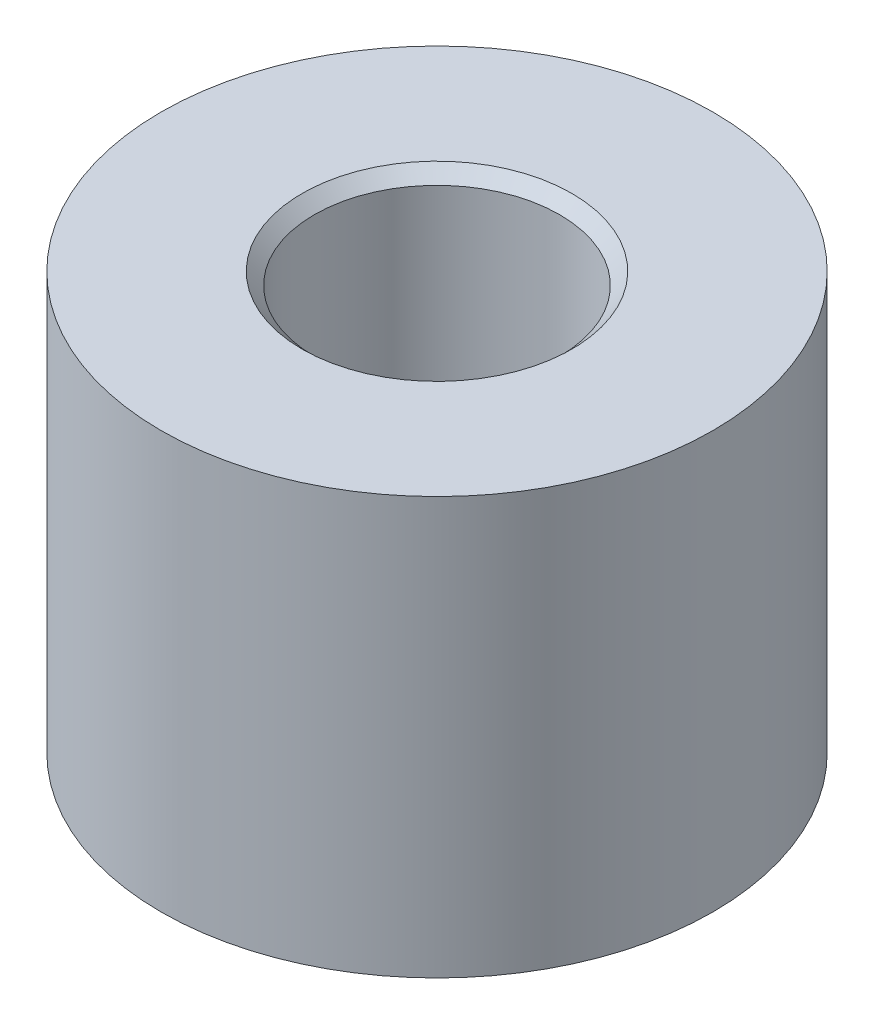
ISO-10303-21;
HEADER;
FILE_DESCRIPTION(('STEP AP214'),'2;1');
FILE_NAME('part.step','',(''),(''),'','','');
FILE_SCHEMA(('AUTOMOTIVE_DESIGN { 1 0 10303 214 1 1 1 1 }'));
ENDSEC;
DATA;
#1=APPLICATION_CONTEXT('core data for automotive mechanical design processes');
#2=APPLICATION_PROTOCOL_DEFINITION('international standard','automotive_design',2000,#1);
#3=PRODUCT_CONTEXT('',#1,'mechanical');
#4=PRODUCT('Part','Part','',(#3));
#5=PRODUCT_RELATED_PRODUCT_CATEGORY('part','',(#4));
#6=PRODUCT_DEFINITION_FORMATION('','',#4);
#7=PRODUCT_DEFINITION_CONTEXT('part definition',#1,'design');
#8=PRODUCT_DEFINITION('design','',#6,#7);
#9=PRODUCT_DEFINITION_SHAPE('','',#8);
#10=(LENGTH_UNIT() NAMED_UNIT(*) SI_UNIT(.MILLI.,.METRE.));
#11=(NAMED_UNIT(*) PLANE_ANGLE_UNIT() SI_UNIT($,.RADIAN.));
#12=(NAMED_UNIT(*) SI_UNIT($,.STERADIAN.) SOLID_ANGLE_UNIT());
#13=UNCERTAINTY_MEASURE_WITH_UNIT(LENGTH_MEASURE(1.E-05),#10,'distance_accuracy_value','');
#14=(GEOMETRIC_REPRESENTATION_CONTEXT(3) GLOBAL_UNCERTAINTY_ASSIGNED_CONTEXT((#13)) GLOBAL_UNIT_ASSIGNED_CONTEXT((#10,
#11,#12)) REPRESENTATION_CONTEXT('',''));
#15=CARTESIAN_POINT('',(0.,0.,0.));
#16=DIRECTION('',(0.,0.,1.));
#17=DIRECTION('',(1.,0.,0.));
#18=AXIS2_PLACEMENT_3D('',#15,#16,#17);
#19=CARTESIAN_POINT('',(0.,35.,0.));
#20=DIRECTION('',(0.,-1.,0.));
#21=DIRECTION('',(0.,0.,-1.));
#22=AXIS2_PLACEMENT_3D('',#19,#20,#21);
#23=CYLINDRICAL_SURFACE('',#22,1.);
#24=CARTESIAN_POINT('',(0.,31.7000000000576,0.));
#25=DIRECTION('',(0.,-1.,0.));
#26=DIRECTION('',(-1.,0.,0.));
#27=AXIS2_PLACEMENT_3D('',#24,#25,#26);
#28=CIRCLE('',#27,1.0000000000332);
#29=CARTESIAN_POINT('',(-1.0000000000332,31.7000000000576,0.));
#30=VERTEX_POINT('',#29);
#31=EDGE_CURVE('E35',#30,#30,#28,.T.);
#32=ORIENTED_EDGE('',*,*,#31,.T.);
#33=EDGE_LOOP('',(#32));
#34=FACE_BOUND('',#33,.T.);
#35=CARTESIAN_POINT('',(0.,34.8999999999933,0.));
#36=DIRECTION('',(0.,1.,0.));
#37=DIRECTION('',(1.,0.,0.));
#38=AXIS2_PLACEMENT_3D('',#35,#36,#37);
#39=CIRCLE('',#38,1.0000000000332);
#40=CARTESIAN_POINT('',(1.0000000000332,34.8999999999933,0.));
#41=VERTEX_POINT('',#40);
#42=EDGE_CURVE('E29',#41,#41,#39,.T.);
#43=ORIENTED_EDGE('',*,*,#42,.T.);
#44=EDGE_LOOP('',(#43));
#45=FACE_BOUND('',#44,.T.);
#46=ADVANCED_FACE('F14',(#34,#45),#23,.F.);
#47=CARTESIAN_POINT('',(0.,34.9999999999682,0.));
#48=DIRECTION('',(0.,1.,0.));
#49=DIRECTION('',(0.,0.,1.));
#50=AXIS2_PLACEMENT_3D('',#47,#48,#49);
#51=CONICAL_SURFACE('',#50,1.09999999995125,0.785398163113231);
#52=ORIENTED_EDGE('',*,*,#42,.F.);
#53=EDGE_LOOP('',(#52));
#54=FACE_BOUND('',#53,.T.);
#55=CARTESIAN_POINT('',(0.,35.000000000025,0.));
#56=DIRECTION('',(0.,1.,0.));
#57=DIRECTION('',(0.,0.,1.));
#58=AXIS2_PLACEMENT_3D('',#55,#56,#57);
#59=CIRCLE('',#58,1.10000000000809);
#60=CARTESIAN_POINT('',(0.,35.000000000025,1.10000000000809));
#61=VERTEX_POINT('',#60);
#62=EDGE_CURVE('E17',#61,#61,#59,.F.);
#63=ORIENTED_EDGE('',*,*,#62,.F.);
#64=EDGE_LOOP('',(#63));
#65=FACE_BOUND('',#64,.T.);
#66=ADVANCED_FACE('F45',(#54,#65),#51,.F.);
#67=CARTESIAN_POINT('',(0.,31.6000000000258,0.));
#68=DIRECTION('',(0.,-1.,0.));
#69=DIRECTION('',(0.,0.,-1.));
#70=AXIS2_PLACEMENT_3D('',#67,#68,#69);
#71=CONICAL_SURFACE('',#70,1.10000000006494,0.785398163397448);
#72=CARTESIAN_POINT('',(0.,31.6000000000258,0.));
#73=DIRECTION('',(0.,-1.,0.));
#74=DIRECTION('',(0.,0.,-1.));
#75=AXIS2_PLACEMENT_3D('',#72,#73,#74);
#76=CIRCLE('',#75,1.10000000006494);
#77=CARTESIAN_POINT('',(0.,31.6000000000258,-1.10000000006494));
#78=VERTEX_POINT('',#77);
#79=EDGE_CURVE('E26',#78,#78,#76,.T.);
#80=ORIENTED_EDGE('',*,*,#79,.T.);
#81=EDGE_LOOP('',(#80));
#82=FACE_BOUND('',#81,.T.);
#83=ORIENTED_EDGE('',*,*,#31,.F.);
#84=EDGE_LOOP('',(#83));
#85=FACE_BOUND('',#84,.T.);
#86=ADVANCED_FACE('F48',(#82,#85),#71,.F.);
#87=CARTESIAN_POINT('',(0.,35.,0.));
#88=DIRECTION('',(0.,1.,0.));
#89=DIRECTION('',(0.,0.,1.));
#90=AXIS2_PLACEMENT_3D('',#87,#88,#89);
#91=PLANE('',#90);
#92=CARTESIAN_POINT('',(0.,35.,0.));
#93=DIRECTION('',(0.,-1.,0.));
#94=DIRECTION('',(0.,0.,-1.));
#95=AXIS2_PLACEMENT_3D('',#92,#93,#94);
#96=CIRCLE('',#95,2.25);
#97=CARTESIAN_POINT('',(0.,35.,-2.25));
#98=VERTEX_POINT('',#97);
#99=EDGE_CURVE('E21',#98,#98,#96,.T.);
#100=ORIENTED_EDGE('',*,*,#99,.F.);
#101=EDGE_LOOP('',(#100));
#102=FACE_BOUND('',#101,.T.);
#103=ORIENTED_EDGE('',*,*,#62,.T.);
#104=EDGE_LOOP('',(#103));
#105=FACE_BOUND('',#104,.T.);
#106=ADVANCED_FACE('F54',(#102,#105),#91,.T.);
#107=CARTESIAN_POINT('',(0.,31.6,0.));
#108=DIRECTION('',(0.,1.,0.));
#109=DIRECTION('',(0.,0.,1.));
#110=AXIS2_PLACEMENT_3D('',#107,#108,#109);
#111=PLANE('',#110);
#112=CARTESIAN_POINT('',(0.,31.6,0.));
#113=DIRECTION('',(0.,-1.,0.));
#114=DIRECTION('',(0.,0.,-1.));
#115=AXIS2_PLACEMENT_3D('',#112,#113,#114);
#116=CIRCLE('',#115,2.25);
#117=CARTESIAN_POINT('',(0.,31.6,-2.25));
#118=VERTEX_POINT('',#117);
#119=EDGE_CURVE('E10',#118,#118,#116,.F.);
#120=ORIENTED_EDGE('',*,*,#119,.F.);
#121=EDGE_LOOP('',(#120));
#122=FACE_BOUND('',#121,.T.);
#123=ORIENTED_EDGE('',*,*,#79,.F.);
#124=EDGE_LOOP('',(#123));
#125=FACE_BOUND('',#124,.T.);
#126=ADVANCED_FACE('F58',(#122,#125),#111,.F.);
#127=CARTESIAN_POINT('',(0.,35.,0.));
#128=DIRECTION('',(0.,-1.,0.));
#129=DIRECTION('',(0.,0.,-1.));
#130=AXIS2_PLACEMENT_3D('',#127,#128,#129);
#131=CYLINDRICAL_SURFACE('',#130,2.25);
#132=ORIENTED_EDGE('',*,*,#119,.T.);
#133=EDGE_LOOP('',(#132));
#134=FACE_BOUND('',#133,.T.);
#135=ORIENTED_EDGE('',*,*,#99,.T.);
#136=EDGE_LOOP('',(#135));
#137=FACE_BOUND('',#136,.T.);
#138=ADVANCED_FACE('F56',(#134,#137),#131,.T.);
#139=CLOSED_SHELL('',(#46,#66,#86,#106,#126,#138));
#140=MANIFOLD_SOLID_BREP('B1',#139);
#141=ADVANCED_BREP_SHAPE_REPRESENTATION('',(#18,#140),#14);
#142=SHAPE_DEFINITION_REPRESENTATION(#9,#141);
ENDSEC;
END-ISO-10303-21;
